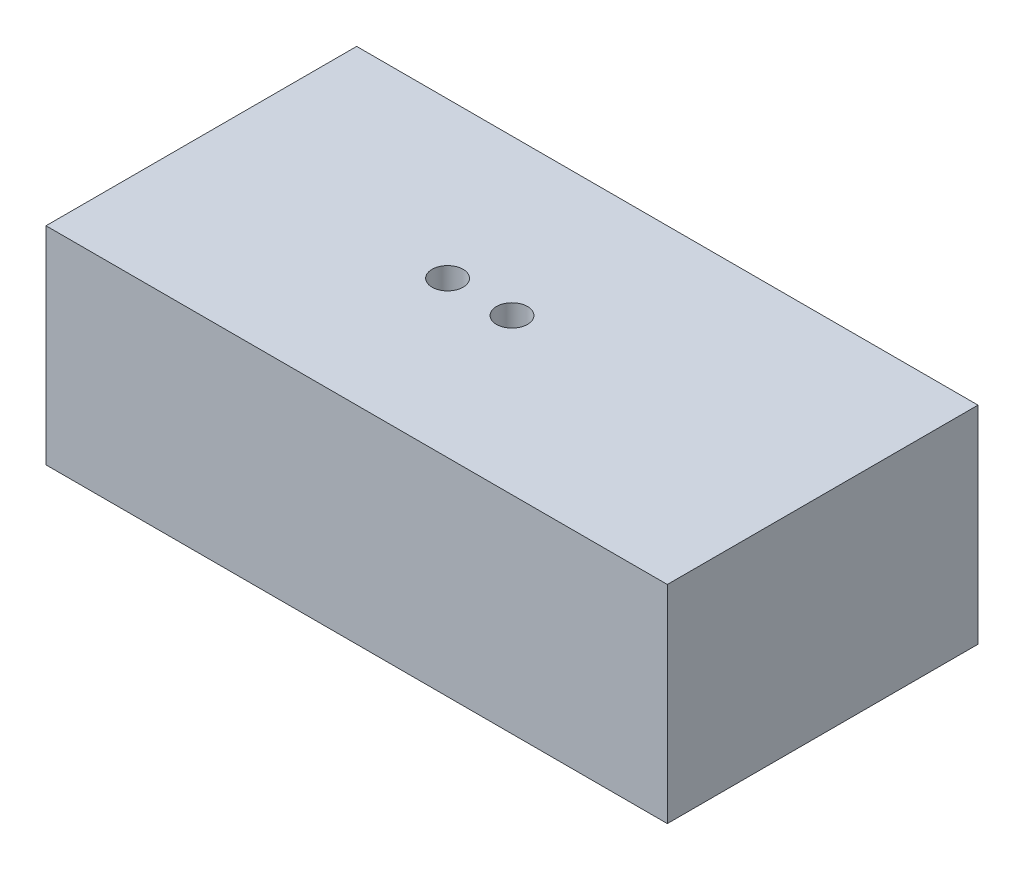
ISO-10303-21;
HEADER;
FILE_DESCRIPTION(('STEP AP214'),'2;1');
FILE_NAME('part.step','',(''),(''),'','','');
FILE_SCHEMA(('AUTOMOTIVE_DESIGN { 1 0 10303 214 1 1 1 1 }'));
ENDSEC;
DATA;
#1=APPLICATION_CONTEXT('core data for automotive mechanical design processes');
#2=APPLICATION_PROTOCOL_DEFINITION('international standard','automotive_design',2000,#1);
#3=PRODUCT_CONTEXT('',#1,'mechanical');
#4=PRODUCT('Part','Part','',(#3));
#5=PRODUCT_RELATED_PRODUCT_CATEGORY('part','',(#4));
#6=PRODUCT_DEFINITION_FORMATION('','',#4);
#7=PRODUCT_DEFINITION_CONTEXT('part definition',#1,'design');
#8=PRODUCT_DEFINITION('design','',#6,#7);
#9=PRODUCT_DEFINITION_SHAPE('','',#8);
#10=(LENGTH_UNIT() NAMED_UNIT(*) SI_UNIT(.MILLI.,.METRE.));
#11=(NAMED_UNIT(*) PLANE_ANGLE_UNIT() SI_UNIT($,.RADIAN.));
#12=(NAMED_UNIT(*) SI_UNIT($,.STERADIAN.) SOLID_ANGLE_UNIT());
#13=UNCERTAINTY_MEASURE_WITH_UNIT(LENGTH_MEASURE(1.E-05),#10,'distance_accuracy_value','');
#14=(GEOMETRIC_REPRESENTATION_CONTEXT(3) GLOBAL_UNCERTAINTY_ASSIGNED_CONTEXT((#13)) GLOBAL_UNIT_ASSIGNED_CONTEXT((#10,
#11,#12)) REPRESENTATION_CONTEXT('',''));
#15=CARTESIAN_POINT('',(0.,0.,0.));
#16=DIRECTION('',(0.,0.,1.));
#17=DIRECTION('',(1.,0.,0.));
#18=AXIS2_PLACEMENT_3D('',#15,#16,#17);
#19=CARTESIAN_POINT('',(0.,10.,0.));
#20=DIRECTION('',(0.,-1.,0.));
#21=DIRECTION('',(0.,0.,-1.));
#22=AXIS2_PLACEMENT_3D('',#19,#20,#21);
#23=PLANE('',#22);
#24=CARTESIAN_POINT('',(0.,10.,0.));
#25=DIRECTION('',(0.,1.,0.));
#26=DIRECTION('',(0.,0.,1.));
#27=AXIS2_PLACEMENT_3D('',#24,#25,#26);
#28=CIRCLE('',#27,0.75);
#29=CARTESIAN_POINT('',(0.,10.,0.75));
#30=VERTEX_POINT('',#29);
#31=EDGE_CURVE('E100',#30,#30,#28,.T.);
#32=ORIENTED_EDGE('',*,*,#31,.F.);
#33=EDGE_LOOP('',(#32));
#34=FACE_BOUND('',#33,.T.);
#35=DIRECTION('',(0.,0.,1.));
#36=VECTOR('',#35,1.);
#37=CARTESIAN_POINT('',(-15.,10.,7.5));
#38=LINE('',#37,#36);
#39=CARTESIAN_POINT('',(-15.,10.,-7.5));
#40=VERTEX_POINT('',#39);
#41=CARTESIAN_POINT('',(-15.,10.,7.5));
#42=VERTEX_POINT('',#41);
#43=EDGE_CURVE('E85',#40,#42,#38,.T.);
#44=ORIENTED_EDGE('',*,*,#43,.T.);
#45=DIRECTION('',(1.,0.,0.));
#46=VECTOR('',#45,1.);
#47=CARTESIAN_POINT('',(-15.,10.,7.5));
#48=LINE('',#47,#46);
#49=CARTESIAN_POINT('',(15.,10.,7.5));
#50=VERTEX_POINT('',#49);
#51=EDGE_CURVE('E80',#42,#50,#48,.T.);
#52=ORIENTED_EDGE('',*,*,#51,.T.);
#53=DIRECTION('',(0.,0.,-1.));
#54=VECTOR('',#53,1.);
#55=CARTESIAN_POINT('',(15.,10.,7.5));
#56=LINE('',#55,#54);
#57=CARTESIAN_POINT('',(15.,10.,-7.5));
#58=VERTEX_POINT('',#57);
#59=EDGE_CURVE('E83',#50,#58,#56,.T.);
#60=ORIENTED_EDGE('',*,*,#59,.T.);
#61=DIRECTION('',(-1.,0.,0.));
#62=VECTOR('',#61,1.);
#63=CARTESIAN_POINT('',(-15.,10.,-7.5));
#64=LINE('',#63,#62);
#65=EDGE_CURVE('E50',#58,#40,#64,.T.);
#66=ORIENTED_EDGE('',*,*,#65,.T.);
#67=EDGE_LOOP('',(#44,#52,#60,#66));
#68=FACE_BOUND('',#67,.T.);
#69=CARTESIAN_POINT('',(-3.11,10.,0.));
#70=DIRECTION('',(0.,1.,0.));
#71=DIRECTION('',(0.,0.,1.));
#72=AXIS2_PLACEMENT_3D('',#69,#70,#71);
#73=CIRCLE('',#72,0.75);
#74=CARTESIAN_POINT('',(-3.11,10.,0.75));
#75=VERTEX_POINT('',#74);
#76=EDGE_CURVE('E115',#75,#75,#73,.T.);
#77=ORIENTED_EDGE('',*,*,#76,.F.);
#78=EDGE_LOOP('',(#77));
#79=FACE_BOUND('',#78,.T.);
#80=ADVANCED_FACE('F33',(#34,#68,#79),#23,.F.);
#81=CARTESIAN_POINT('',(0.,0.,0.));
#82=DIRECTION('',(0.,-1.,0.));
#83=DIRECTION('',(0.,0.,-1.));
#84=AXIS2_PLACEMENT_3D('',#81,#82,#83);
#85=PLANE('',#84);
#86=CARTESIAN_POINT('',(0.,0.,0.));
#87=DIRECTION('',(0.,1.,0.));
#88=DIRECTION('',(0.,0.,1.));
#89=AXIS2_PLACEMENT_3D('',#86,#87,#88);
#90=CIRCLE('',#89,0.75);
#91=CARTESIAN_POINT('',(0.,0.,0.75));
#92=VERTEX_POINT('',#91);
#93=EDGE_CURVE('E112',#92,#92,#90,.T.);
#94=ORIENTED_EDGE('',*,*,#93,.T.);
#95=EDGE_LOOP('',(#94));
#96=FACE_BOUND('',#95,.T.);
#97=DIRECTION('',(0.,0.,1.));
#98=VECTOR('',#97,1.);
#99=CARTESIAN_POINT('',(-15.,0.,7.5));
#100=LINE('',#99,#98);
#101=CARTESIAN_POINT('',(-15.,0.,-7.5));
#102=VERTEX_POINT('',#101);
#103=CARTESIAN_POINT('',(-15.,0.,7.5));
#104=VERTEX_POINT('',#103);
#105=EDGE_CURVE('E97',#102,#104,#100,.T.);
#106=ORIENTED_EDGE('',*,*,#105,.F.);
#107=DIRECTION('',(-1.,0.,0.));
#108=VECTOR('',#107,1.);
#109=CARTESIAN_POINT('',(-15.,0.,-7.5));
#110=LINE('',#109,#108);
#111=CARTESIAN_POINT('',(15.,0.,-7.5));
#112=VERTEX_POINT('',#111);
#113=EDGE_CURVE('E73',#112,#102,#110,.T.);
#114=ORIENTED_EDGE('',*,*,#113,.F.);
#115=DIRECTION('',(0.,0.,-1.));
#116=VECTOR('',#115,1.);
#117=CARTESIAN_POINT('',(15.,0.,7.5));
#118=LINE('',#117,#116);
#119=CARTESIAN_POINT('',(15.,0.,7.5));
#120=VERTEX_POINT('',#119);
#121=EDGE_CURVE('E67',#120,#112,#118,.T.);
#122=ORIENTED_EDGE('',*,*,#121,.F.);
#123=DIRECTION('',(1.,0.,0.));
#124=VECTOR('',#123,1.);
#125=CARTESIAN_POINT('',(-15.,0.,7.5));
#126=LINE('',#125,#124);
#127=EDGE_CURVE('E89',#104,#120,#126,.T.);
#128=ORIENTED_EDGE('',*,*,#127,.F.);
#129=EDGE_LOOP('',(#106,#114,#122,#128));
#130=FACE_BOUND('',#129,.T.);
#131=CARTESIAN_POINT('',(-3.11,0.,0.));
#132=DIRECTION('',(0.,1.,0.));
#133=DIRECTION('',(0.,0.,1.));
#134=AXIS2_PLACEMENT_3D('',#131,#132,#133);
#135=CIRCLE('',#134,0.75);
#136=CARTESIAN_POINT('',(-3.11,0.,0.75));
#137=VERTEX_POINT('',#136);
#138=EDGE_CURVE('E118',#137,#137,#135,.T.);
#139=ORIENTED_EDGE('',*,*,#138,.T.);
#140=EDGE_LOOP('',(#139));
#141=FACE_BOUND('',#140,.T.);
#142=ADVANCED_FACE('F108',(#96,#130,#141),#85,.T.);
#143=CARTESIAN_POINT('',(-15.,10.,7.5));
#144=DIRECTION('',(1.,0.,0.));
#145=DIRECTION('',(0.,0.,-1.));
#146=AXIS2_PLACEMENT_3D('',#143,#144,#145);
#147=PLANE('',#146);
#148=ORIENTED_EDGE('',*,*,#105,.T.);
#149=DIRECTION('',(0.,-1.,0.));
#150=VECTOR('',#149,1.);
#151=CARTESIAN_POINT('',(-15.,10.,7.5));
#152=LINE('',#151,#150);
#153=EDGE_CURVE('E11',#42,#104,#152,.T.);
#154=ORIENTED_EDGE('',*,*,#153,.F.);
#155=ORIENTED_EDGE('',*,*,#43,.F.);
#156=DIRECTION('',(0.,-1.,0.));
#157=VECTOR('',#156,1.);
#158=CARTESIAN_POINT('',(-15.,10.,-7.5));
#159=LINE('',#158,#157);
#160=EDGE_CURVE('E93',#40,#102,#159,.T.);
#161=ORIENTED_EDGE('',*,*,#160,.T.);
#162=EDGE_LOOP('',(#148,#154,#155,#161));
#163=FACE_BOUND('',#162,.T.);
#164=ADVANCED_FACE('F35',(#163),#147,.F.);
#165=CARTESIAN_POINT('',(-15.,10.,7.5));
#166=DIRECTION('',(0.,0.,-1.));
#167=DIRECTION('',(-1.,0.,0.));
#168=AXIS2_PLACEMENT_3D('',#165,#166,#167);
#169=PLANE('',#168);
#170=ORIENTED_EDGE('',*,*,#127,.T.);
#171=DIRECTION('',(0.,-1.,0.));
#172=VECTOR('',#171,1.);
#173=CARTESIAN_POINT('',(15.,10.,7.5));
#174=LINE('',#173,#172);
#175=EDGE_CURVE('E42',#50,#120,#174,.T.);
#176=ORIENTED_EDGE('',*,*,#175,.F.);
#177=ORIENTED_EDGE('',*,*,#51,.F.);
#178=ORIENTED_EDGE('',*,*,#153,.T.);
#179=EDGE_LOOP('',(#170,#176,#177,#178));
#180=FACE_BOUND('',#179,.T.);
#181=ADVANCED_FACE('F88',(#180),#169,.F.);
#182=CARTESIAN_POINT('',(15.,10.,7.5));
#183=DIRECTION('',(-1.,0.,0.));
#184=DIRECTION('',(0.,0.,1.));
#185=AXIS2_PLACEMENT_3D('',#182,#183,#184);
#186=PLANE('',#185);
#187=ORIENTED_EDGE('',*,*,#121,.T.);
#188=DIRECTION('',(0.,-1.,0.));
#189=VECTOR('',#188,1.);
#190=CARTESIAN_POINT('',(15.,10.,-7.5));
#191=LINE('',#190,#189);
#192=EDGE_CURVE('E90',#58,#112,#191,.T.);
#193=ORIENTED_EDGE('',*,*,#192,.F.);
#194=ORIENTED_EDGE('',*,*,#59,.F.);
#195=ORIENTED_EDGE('',*,*,#175,.T.);
#196=EDGE_LOOP('',(#187,#193,#194,#195));
#197=FACE_BOUND('',#196,.T.);
#198=ADVANCED_FACE('F91',(#197),#186,.F.);
#199=CARTESIAN_POINT('',(-15.,10.,-7.5));
#200=DIRECTION('',(0.,0.,1.));
#201=DIRECTION('',(1.,0.,0.));
#202=AXIS2_PLACEMENT_3D('',#199,#200,#201);
#203=PLANE('',#202);
#204=ORIENTED_EDGE('',*,*,#113,.T.);
#205=ORIENTED_EDGE('',*,*,#160,.F.);
#206=ORIENTED_EDGE('',*,*,#65,.F.);
#207=ORIENTED_EDGE('',*,*,#192,.T.);
#208=EDGE_LOOP('',(#204,#205,#206,#207));
#209=FACE_BOUND('',#208,.T.);
#210=ADVANCED_FACE('F105',(#209),#203,.F.);
#211=CARTESIAN_POINT('',(0.,10.,0.));
#212=DIRECTION('',(0.,-1.,0.));
#213=DIRECTION('',(0.,0.,-1.));
#214=AXIS2_PLACEMENT_3D('',#211,#212,#213);
#215=CYLINDRICAL_SURFACE('',#214,0.75);
#216=ORIENTED_EDGE('',*,*,#31,.T.);
#217=EDGE_LOOP('',(#216));
#218=FACE_BOUND('',#217,.T.);
#219=ORIENTED_EDGE('',*,*,#93,.F.);
#220=EDGE_LOOP('',(#219));
#221=FACE_BOUND('',#220,.T.);
#222=ADVANCED_FACE('F136',(#218,#221),#215,.F.);
#223=CARTESIAN_POINT('',(-3.11,10.,0.));
#224=DIRECTION('',(0.,-1.,0.));
#225=DIRECTION('',(0.,0.,-1.));
#226=AXIS2_PLACEMENT_3D('',#223,#224,#225);
#227=CYLINDRICAL_SURFACE('',#226,0.75);
#228=ORIENTED_EDGE('',*,*,#76,.T.);
#229=EDGE_LOOP('',(#228));
#230=FACE_BOUND('',#229,.T.);
#231=ORIENTED_EDGE('',*,*,#138,.F.);
#232=EDGE_LOOP('',(#231));
#233=FACE_BOUND('',#232,.T.);
#234=ADVANCED_FACE('F124',(#230,#233),#227,.F.);
#235=CLOSED_SHELL('',(#80,#142,#164,#181,#198,#210,#222,#234));
#236=MANIFOLD_SOLID_BREP('B2',#235);
#237=ADVANCED_BREP_SHAPE_REPRESENTATION('',(#18,#236),#14);
#238=SHAPE_DEFINITION_REPRESENTATION(#9,#237);
ENDSEC;
END-ISO-10303-21;
